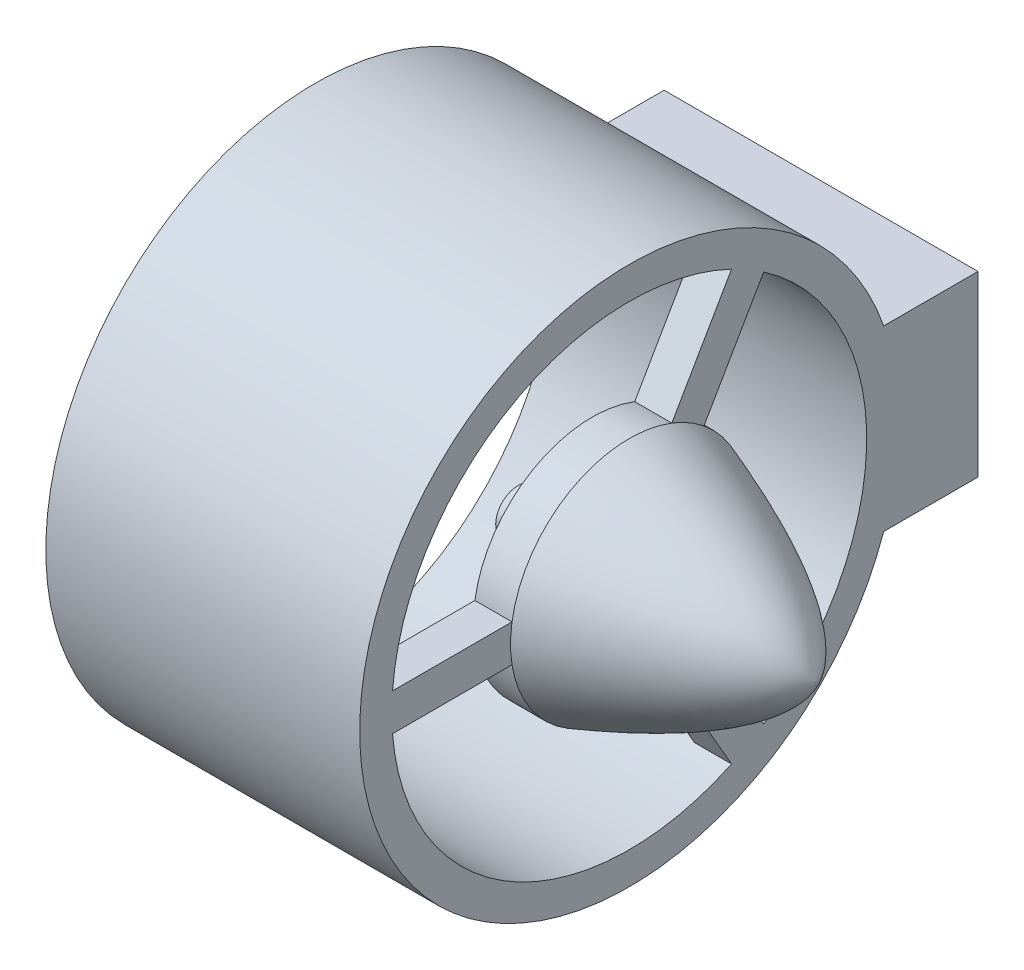
ISO-10303-21;
HEADER;
FILE_DESCRIPTION(('STEP AP214'),'2;1');
FILE_NAME('part.step','',(''),(''),'','','');
FILE_SCHEMA(('AUTOMOTIVE_DESIGN { 1 0 10303 214 1 1 1 1 }'));
ENDSEC;
DATA;
#1=APPLICATION_CONTEXT('core data for automotive mechanical design processes');
#2=APPLICATION_PROTOCOL_DEFINITION('international standard','automotive_design',2000,#1);
#3=PRODUCT_CONTEXT('',#1,'mechanical');
#4=PRODUCT('Part','Part','',(#3));
#5=PRODUCT_RELATED_PRODUCT_CATEGORY('part','',(#4));
#6=PRODUCT_DEFINITION_FORMATION('','',#4);
#7=PRODUCT_DEFINITION_CONTEXT('part definition',#1,'design');
#8=PRODUCT_DEFINITION('design','',#6,#7);
#9=PRODUCT_DEFINITION_SHAPE('','',#8);
#10=(LENGTH_UNIT() NAMED_UNIT(*) SI_UNIT(.MILLI.,.METRE.));
#11=(NAMED_UNIT(*) PLANE_ANGLE_UNIT() SI_UNIT($,.RADIAN.));
#12=(NAMED_UNIT(*) SI_UNIT($,.STERADIAN.) SOLID_ANGLE_UNIT());
#13=UNCERTAINTY_MEASURE_WITH_UNIT(LENGTH_MEASURE(1.E-05),#10,'distance_accuracy_value','');
#14=(GEOMETRIC_REPRESENTATION_CONTEXT(3) GLOBAL_UNCERTAINTY_ASSIGNED_CONTEXT((#13)) GLOBAL_UNIT_ASSIGNED_CONTEXT((#10,
#11,#12)) REPRESENTATION_CONTEXT('',''));
#15=CARTESIAN_POINT('',(0.,0.,0.));
#16=DIRECTION('',(0.,0.,1.));
#17=DIRECTION('',(1.,0.,0.));
#18=AXIS2_PLACEMENT_3D('',#15,#16,#17);
#19=CARTESIAN_POINT('',(-5.,0.,-47.));
#20=DIRECTION('',(0.,0.,1.));
#21=DIRECTION('',(1.,0.,0.));
#22=AXIS2_PLACEMENT_3D('',#19,#20,#21);
#23=PLANE('',#22);
#24=CARTESIAN_POINT('',(-3.65,-8.,-47.));
#25=DIRECTION('',(0.,0.,-1.));
#26=DIRECTION('',(-1.,0.,0.));
#27=AXIS2_PLACEMENT_3D('',#24,#25,#26);
#28=CIRCLE('',#27,1.24999999999999);
#29=CARTESIAN_POINT('',(-4.89999999999999,-8.,-47.));
#30=VERTEX_POINT('',#29);
#31=EDGE_CURVE('E194',#30,#30,#28,.T.);
#32=ORIENTED_EDGE('',*,*,#31,.F.);
#33=EDGE_LOOP('',(#32));
#34=FACE_BOUND('',#33,.T.);
#35=CARTESIAN_POINT('',(-3.65,8.,-47.));
#36=DIRECTION('',(0.,0.,-1.));
#37=DIRECTION('',(-1.,0.,0.));
#38=AXIS2_PLACEMENT_3D('',#35,#36,#37);
#39=CIRCLE('',#38,1.24999999999999);
#40=CARTESIAN_POINT('',(-4.89999999999999,8.,-47.));
#41=VERTEX_POINT('',#40);
#42=EDGE_CURVE('E193',#41,#41,#39,.T.);
#43=ORIENTED_EDGE('',*,*,#42,.F.);
#44=EDGE_LOOP('',(#43));
#45=FACE_BOUND('',#44,.T.);
#46=CARTESIAN_POINT('',(-38.65,8.,-47.));
#47=DIRECTION('',(0.,0.,-1.));
#48=DIRECTION('',(-1.,0.,0.));
#49=AXIS2_PLACEMENT_3D('',#46,#47,#48);
#50=CIRCLE('',#49,1.24999999999999);
#51=CARTESIAN_POINT('',(-39.9,8.,-47.));
#52=VERTEX_POINT('',#51);
#53=EDGE_CURVE('E204',#52,#52,#50,.T.);
#54=ORIENTED_EDGE('',*,*,#53,.F.);
#55=EDGE_LOOP('',(#54));
#56=FACE_BOUND('',#55,.T.);
#57=CARTESIAN_POINT('',(-42.6667808219178,0.,-47.));
#58=DIRECTION('',(0.,0.,-1.));
#59=DIRECTION('',(-1.,0.,0.));
#60=AXIS2_PLACEMENT_3D('',#57,#58,#59);
#61=CIRCLE('',#60,4.01678082191781);
#62=CARTESIAN_POINT('',(-42.3,-4.,-47.));
#63=VERTEX_POINT('',#62);
#64=CARTESIAN_POINT('',(-42.3,4.,-47.));
#65=VERTEX_POINT('',#64);
#66=EDGE_CURVE('E238',#63,#65,#61,.F.);
#67=ORIENTED_EDGE('',*,*,#66,.T.);
#68=DIRECTION('',(0.,-1.,0.));
#69=VECTOR('',#68,1.);
#70=CARTESIAN_POINT('',(-42.3,12.,-47.));
#71=LINE('',#70,#69);
#72=CARTESIAN_POINT('',(-42.3,12.,-47.));
#73=VERTEX_POINT('',#72);
#74=EDGE_CURVE('E261',#73,#65,#71,.T.);
#75=ORIENTED_EDGE('',*,*,#74,.F.);
#76=DIRECTION('',(1.,0.,0.));
#77=VECTOR('',#76,1.);
#78=CARTESIAN_POINT('',(-5.,12.,-47.));
#79=LINE('',#78,#77);
#80=CARTESIAN_POINT('',(0.,12.,-47.));
#81=VERTEX_POINT('',#80);
#82=EDGE_CURVE('E324',#73,#81,#79,.T.);
#83=ORIENTED_EDGE('',*,*,#82,.T.);
#84=DIRECTION('',(0.,-1.,0.));
#85=VECTOR('',#84,1.);
#86=CARTESIAN_POINT('',(0.,0.,-47.));
#87=LINE('',#86,#85);
#88=CARTESIAN_POINT('',(0.,-12.,-47.));
#89=VERTEX_POINT('',#88);
#90=EDGE_CURVE('E272',#81,#89,#87,.T.);
#91=ORIENTED_EDGE('',*,*,#90,.T.);
#92=DIRECTION('',(1.,0.,0.));
#93=VECTOR('',#92,1.);
#94=CARTESIAN_POINT('',(-5.,-12.,-47.));
#95=LINE('',#94,#93);
#96=CARTESIAN_POINT('',(-42.3,-12.,-47.));
#97=VERTEX_POINT('',#96);
#98=EDGE_CURVE('E327',#97,#89,#95,.T.);
#99=ORIENTED_EDGE('',*,*,#98,.F.);
#100=EDGE_CURVE('E260',#63,#97,#71,.T.);
#101=ORIENTED_EDGE('',*,*,#100,.F.);
#102=EDGE_LOOP('',(#67,#75,#83,#91,#99,#101));
#103=FACE_BOUND('',#102,.T.);
#104=CARTESIAN_POINT('',(-38.65,-8.,-47.));
#105=DIRECTION('',(0.,0.,-1.));
#106=DIRECTION('',(-1.,0.,0.));
#107=AXIS2_PLACEMENT_3D('',#104,#105,#106);
#108=CIRCLE('',#107,1.24999999999999);
#109=CARTESIAN_POINT('',(-39.9,-8.,-47.));
#110=VERTEX_POINT('',#109);
#111=EDGE_CURVE('E210',#110,#110,#108,.T.);
#112=ORIENTED_EDGE('',*,*,#111,.F.);
#113=EDGE_LOOP('',(#112));
#114=FACE_BOUND('',#113,.T.);
#115=ADVANCED_FACE('F40',(#34,#45,#56,#103,#114),#23,.F.);
#116=CARTESIAN_POINT('',(-42.3,0.,0.));
#117=DIRECTION('',(-1.,0.,0.));
#118=DIRECTION('',(0.,0.,1.));
#119=AXIS2_PLACEMENT_3D('',#116,#117,#118);
#120=PLANE('',#119);
#121=CARTESIAN_POINT('',(-42.3,29.4448637286709,-17.));
#122=DIRECTION('',(-1.,0.,0.));
#123=DIRECTION('',(0.,0.,1.));
#124=AXIS2_PLACEMENT_3D('',#121,#122,#123);
#125=CIRCLE('',#124,1.);
#126=CARTESIAN_POINT('',(-42.3,29.4448637286709,-16.));
#127=VERTEX_POINT('',#126);
#128=EDGE_CURVE('E221',#127,#127,#125,.T.);
#129=ORIENTED_EDGE('',*,*,#128,.F.);
#130=EDGE_LOOP('',(#129));
#131=FACE_BOUND('',#130,.T.);
#132=CARTESIAN_POINT('',(-42.3,-29.4448637286708,-17.0000000000001));
#133=DIRECTION('',(-1.,0.,0.));
#134=DIRECTION('',(0.,0.,1.));
#135=AXIS2_PLACEMENT_3D('',#132,#133,#134);
#136=CIRCLE('',#135,1.);
#137=CARTESIAN_POINT('',(-42.3,-29.4448637286708,-16.0000000000001));
#138=VERTEX_POINT('',#137);
#139=EDGE_CURVE('E216',#138,#138,#136,.T.);
#140=ORIENTED_EDGE('',*,*,#139,.F.);
#141=EDGE_LOOP('',(#140));
#142=FACE_BOUND('',#141,.T.);
#143=CARTESIAN_POINT('',(-42.3,0.,34.));
#144=DIRECTION('',(-1.,0.,0.));
#145=DIRECTION('',(0.,0.,1.));
#146=AXIS2_PLACEMENT_3D('',#143,#144,#145);
#147=CIRCLE('',#146,0.999999999999998);
#148=CARTESIAN_POINT('',(-42.3,0.,35.));
#149=VERTEX_POINT('',#148);
#150=EDGE_CURVE('E220',#149,#149,#147,.T.);
#151=ORIENTED_EDGE('',*,*,#150,.F.);
#152=EDGE_LOOP('',(#151));
#153=FACE_BOUND('',#152,.T.);
#154=CARTESIAN_POINT('',(-42.3,0.,0.));
#155=DIRECTION('',(-1.,0.,0.));
#156=DIRECTION('',(0.,0.,1.));
#157=AXIS2_PLACEMENT_3D('',#154,#155,#156);
#158=CIRCLE('',#157,32.);
#159=CARTESIAN_POINT('',(-42.3,0.,32.));
#160=VERTEX_POINT('',#159);
#161=EDGE_CURVE('E249',#160,#160,#158,.T.);
#162=ORIENTED_EDGE('',*,*,#161,.F.);
#163=EDGE_LOOP('',(#162));
#164=FACE_BOUND('',#163,.T.);
#165=ORIENTED_EDGE('',*,*,#74,.T.);
#166=DIRECTION('',(0.,0.,-1.));
#167=VECTOR('',#166,1.);
#168=CARTESIAN_POINT('',(-42.3,4.,-42.));
#169=LINE('',#168,#167);
#170=CARTESIAN_POINT('',(-42.3,4.,-42.));
#171=VERTEX_POINT('',#170);
#172=EDGE_CURVE('E247',#171,#65,#169,.T.);
#173=ORIENTED_EDGE('',*,*,#172,.F.);
#174=DIRECTION('',(0.,1.,0.));
#175=VECTOR('',#174,1.);
#176=CARTESIAN_POINT('',(-42.3,0.,-42.));
#177=LINE('',#176,#175);
#178=CARTESIAN_POINT('',(-42.3,-4.,-42.));
#179=VERTEX_POINT('',#178);
#180=EDGE_CURVE('E242',#179,#171,#177,.T.);
#181=ORIENTED_EDGE('',*,*,#180,.F.);
#182=DIRECTION('',(0.,0.,-1.));
#183=VECTOR('',#182,1.);
#184=CARTESIAN_POINT('',(-42.3,-4.,-42.));
#185=LINE('',#184,#183);
#186=EDGE_CURVE('E244',#179,#63,#185,.T.);
#187=ORIENTED_EDGE('',*,*,#186,.T.);
#188=ORIENTED_EDGE('',*,*,#100,.T.);
#189=DIRECTION('',(0.,0.,1.));
#190=VECTOR('',#189,1.);
#191=CARTESIAN_POINT('',(-42.3,-12.,-47.));
#192=LINE('',#191,#190);
#193=CARTESIAN_POINT('',(-42.3,-12.,-34.2909448688717));
#194=VERTEX_POINT('',#193);
#195=EDGE_CURVE('E264',#97,#194,#192,.T.);
#196=ORIENTED_EDGE('',*,*,#195,.T.);
#197=CARTESIAN_POINT('',(-42.3,0.,0.));
#198=DIRECTION('',(-1.,0.,0.));
#199=DIRECTION('',(0.,0.,1.));
#200=AXIS2_PLACEMENT_3D('',#197,#198,#199);
#201=CIRCLE('',#200,36.33);
#202=CARTESIAN_POINT('',(-42.3,12.,-34.2909448688717));
#203=VERTEX_POINT('',#202);
#204=EDGE_CURVE('E253',#194,#203,#201,.T.);
#205=ORIENTED_EDGE('',*,*,#204,.T.);
#206=DIRECTION('',(0.,0.,-1.));
#207=VECTOR('',#206,1.);
#208=CARTESIAN_POINT('',(-42.3,12.,-34.2909448688717));
#209=LINE('',#208,#207);
#210=EDGE_CURVE('E257',#203,#73,#209,.T.);
#211=ORIENTED_EDGE('',*,*,#210,.T.);
#212=EDGE_LOOP('',(#165,#173,#181,#187,#188,#196,#205,#211));
#213=FACE_BOUND('',#212,.T.);
#214=ADVANCED_FACE('F425',(#131,#142,#153,#164,#213),#120,.T.);
#215=CARTESIAN_POINT('',(-5.,0.,0.));
#216=DIRECTION('',(-1.,0.,0.));
#217=DIRECTION('',(0.,0.,1.));
#218=AXIS2_PLACEMENT_3D('',#215,#216,#217);
#219=PLANE('',#218);
#220=CARTESIAN_POINT('',(-5.,0.,0.));
#221=DIRECTION('',(-1.,0.,0.));
#222=DIRECTION('',(0.,0.,1.));
#223=AXIS2_PLACEMENT_3D('',#220,#221,#222);
#224=CIRCLE('',#223,3.);
#225=CARTESIAN_POINT('',(-5.,0.,3.));
#226=VERTEX_POINT('',#225);
#227=EDGE_CURVE('E232',#226,#226,#224,.T.);
#228=ORIENTED_EDGE('',*,*,#227,.F.);
#229=EDGE_LOOP('',(#228));
#230=FACE_BOUND('',#229,.T.);
#231=DIRECTION('',(0.,0.86602540378444,-0.499999999999998));
#232=VECTOR('',#231,1.);
#233=CARTESIAN_POINT('',(-5.,1.24999999999999,2.1650635094611));
#234=LINE('',#233,#232);
#235=CARTESIAN_POINT('',(-5.,14.936215693171,-5.73667680517842));
#236=VERTEX_POINT('',#235);
#237=CARTESIAN_POINT('',(-5.,28.8781106845908,-13.7860336314881));
#238=VERTEX_POINT('',#237);
#239=EDGE_CURVE('E281',#236,#238,#234,.T.);
#240=ORIENTED_EDGE('',*,*,#239,.T.);
#241=CARTESIAN_POINT('',(-5.,0.,0.));
#242=DIRECTION('',(-1.,0.,0.));
#243=DIRECTION('',(0.,0.,1.));
#244=AXIS2_PLACEMENT_3D('',#241,#242,#243);
#245=CIRCLE('',#244,32.);
#246=CARTESIAN_POINT('',(-5.,26.3781106845908,-18.1161606504103));
#247=VERTEX_POINT('',#246);
#248=EDGE_CURVE('E11',#238,#247,#245,.T.);
#249=ORIENTED_EDGE('',*,*,#248,.T.);
#250=DIRECTION('',(0.,0.86602540378444,-0.499999999999998));
#251=VECTOR('',#250,1.);
#252=CARTESIAN_POINT('',(-5.,-1.24999999999999,-2.1650635094611));
#253=LINE('',#252,#251);
#254=CARTESIAN_POINT('',(-5.,12.436215693171,-10.0668038241006));
#255=VERTEX_POINT('',#254);
#256=EDGE_CURVE('E284',#255,#247,#253,.T.);
#257=ORIENTED_EDGE('',*,*,#256,.F.);
#258=CARTESIAN_POINT('',(-5.,0.,0.));
#259=DIRECTION('',(-1.,0.,0.));
#260=DIRECTION('',(0.,0.,1.));
#261=AXIS2_PLACEMENT_3D('',#258,#259,#260);
#262=CIRCLE('',#261,16.);
#263=CARTESIAN_POINT('',(-5.,-12.436215693171,-10.0668038241006));
#264=VERTEX_POINT('',#263);
#265=EDGE_CURVE('E366',#255,#264,#262,.T.);
#266=ORIENTED_EDGE('',*,*,#265,.T.);
#267=DIRECTION('',(0.,-0.86602540378444,-0.499999999999998));
#268=VECTOR('',#267,1.);
#269=CARTESIAN_POINT('',(-5.,1.25,-2.1650635094611));
#270=LINE('',#269,#268);
#271=CARTESIAN_POINT('',(-5.,-26.3781106845908,-18.1161606504103));
#272=VERTEX_POINT('',#271);
#273=EDGE_CURVE('E268',#264,#272,#270,.T.);
#274=ORIENTED_EDGE('',*,*,#273,.T.);
#275=CARTESIAN_POINT('',(-5.,-28.8781106845908,-13.7860336314881));
#276=VERTEX_POINT('',#275);
#277=EDGE_CURVE('E51',#272,#276,#245,.T.);
#278=ORIENTED_EDGE('',*,*,#277,.T.);
#279=DIRECTION('',(0.,-0.86602540378444,-0.499999999999998));
#280=VECTOR('',#279,1.);
#281=CARTESIAN_POINT('',(-5.,-1.25,2.1650635094611));
#282=LINE('',#281,#280);
#283=CARTESIAN_POINT('',(-5.,-14.936215693171,-5.73667680517843));
#284=VERTEX_POINT('',#283);
#285=EDGE_CURVE('E271',#284,#276,#282,.T.);
#286=ORIENTED_EDGE('',*,*,#285,.F.);
#287=CARTESIAN_POINT('',(-5.,-2.5,15.8034806292791));
#288=VERTEX_POINT('',#287);
#289=EDGE_CURVE('E367',#284,#288,#262,.T.);
#290=ORIENTED_EDGE('',*,*,#289,.T.);
#291=DIRECTION('',(0.,0.,1.));
#292=VECTOR('',#291,1.);
#293=CARTESIAN_POINT('',(-5.,-2.5,0.));
#294=LINE('',#293,#292);
#295=CARTESIAN_POINT('',(-5.,-2.5,31.9021942818985));
#296=VERTEX_POINT('',#295);
#297=EDGE_CURVE('E275',#288,#296,#294,.T.);
#298=ORIENTED_EDGE('',*,*,#297,.T.);
#299=CARTESIAN_POINT('',(-5.,2.5,31.9021942818985));
#300=VERTEX_POINT('',#299);
#301=EDGE_CURVE('E53',#296,#300,#245,.T.);
#302=ORIENTED_EDGE('',*,*,#301,.T.);
#303=DIRECTION('',(0.,0.,1.));
#304=VECTOR('',#303,1.);
#305=CARTESIAN_POINT('',(-5.,2.5,0.));
#306=LINE('',#305,#304);
#307=CARTESIAN_POINT('',(-5.,2.5,15.8034806292791));
#308=VERTEX_POINT('',#307);
#309=EDGE_CURVE('E278',#308,#300,#306,.T.);
#310=ORIENTED_EDGE('',*,*,#309,.F.);
#311=EDGE_CURVE('E364',#308,#236,#262,.T.);
#312=ORIENTED_EDGE('',*,*,#311,.T.);
#313=EDGE_LOOP('',(#240,#249,#257,#266,#274,#278,#286,#290,#298,#302,#310,#312));
#314=FACE_BOUND('',#313,.T.);
#315=ADVANCED_FACE('F405',(#230,#314),#219,.T.);
#316=CARTESIAN_POINT('',(-5.,0.,0.));
#317=DIRECTION('',(1.,0.,0.));
#318=DIRECTION('',(0.,0.,-1.));
#319=AXIS2_PLACEMENT_3D('',#316,#317,#318);
#320=CYLINDRICAL_SURFACE('',#319,16.);
#321=DIRECTION('',(1.,0.,0.));
#322=VECTOR('',#321,1.);
#323=CARTESIAN_POINT('',(-5.,14.936215693171,-5.73667680517842));
#324=LINE('',#323,#322);
#325=CARTESIAN_POINT('',(0.,14.936215693171,-5.73667680517842));
#326=VERTEX_POINT('',#325);
#327=EDGE_CURVE('E339',#236,#326,#324,.T.);
#328=ORIENTED_EDGE('',*,*,#327,.F.);
#329=ORIENTED_EDGE('',*,*,#311,.F.);
#330=DIRECTION('',(1.,0.,0.));
#331=VECTOR('',#330,1.);
#332=CARTESIAN_POINT('',(-5.,2.5,15.8034806292791));
#333=LINE('',#332,#331);
#334=CARTESIAN_POINT('',(0.,2.5,15.8034806292791));
#335=VERTEX_POINT('',#334);
#336=EDGE_CURVE('E347',#308,#335,#333,.T.);
#337=ORIENTED_EDGE('',*,*,#336,.T.);
#338=CARTESIAN_POINT('',(0.,0.,0.));
#339=DIRECTION('',(-1.,0.,0.));
#340=DIRECTION('',(0.,0.,1.));
#341=AXIS2_PLACEMENT_3D('',#338,#339,#340);
#342=CIRCLE('',#341,16.);
#343=EDGE_CURVE('E368',#335,#326,#342,.T.);
#344=ORIENTED_EDGE('',*,*,#343,.T.);
#345=EDGE_LOOP('',(#328,#329,#337,#344));
#346=FACE_BOUND('',#345,.T.);
#347=ADVANCED_FACE('F518',(#346),#320,.T.);
#348=DIRECTION('',(1.,0.,0.));
#349=VECTOR('',#348,1.);
#350=CARTESIAN_POINT('',(-5.,-2.5,15.8034806292791));
#351=LINE('',#350,#349);
#352=CARTESIAN_POINT('',(0.,-2.5,15.8034806292791));
#353=VERTEX_POINT('',#352);
#354=EDGE_CURVE('E67',#288,#353,#351,.T.);
#355=ORIENTED_EDGE('',*,*,#354,.F.);
#356=ORIENTED_EDGE('',*,*,#289,.F.);
#357=DIRECTION('',(1.,0.,0.));
#358=VECTOR('',#357,1.);
#359=CARTESIAN_POINT('',(-5.,-14.936215693171,-5.73667680517843));
#360=LINE('',#359,#358);
#361=CARTESIAN_POINT('',(0.,-14.936215693171,-5.73667680517843));
#362=VERTEX_POINT('',#361);
#363=EDGE_CURVE('E356',#284,#362,#360,.T.);
#364=ORIENTED_EDGE('',*,*,#363,.T.);
#365=EDGE_CURVE('E326',#362,#353,#342,.T.);
#366=ORIENTED_EDGE('',*,*,#365,.T.);
#367=EDGE_LOOP('',(#355,#356,#364,#366));
#368=FACE_BOUND('',#367,.T.);
#369=ADVANCED_FACE('F373',(#368),#320,.T.);
#370=ORIENTED_EDGE('',*,*,#265,.F.);
#371=DIRECTION('',(1.,0.,0.));
#372=VECTOR('',#371,1.);
#373=CARTESIAN_POINT('',(-5.,12.436215693171,-10.0668038241006));
#374=LINE('',#373,#372);
#375=CARTESIAN_POINT('',(0.,12.436215693171,-10.0668038241006));
#376=VERTEX_POINT('',#375);
#377=EDGE_CURVE('E336',#255,#376,#374,.T.);
#378=ORIENTED_EDGE('',*,*,#377,.T.);
#379=CARTESIAN_POINT('',(0.,-12.436215693171,-10.0668038241006));
#380=VERTEX_POINT('',#379);
#381=EDGE_CURVE('E370',#376,#380,#342,.T.);
#382=ORIENTED_EDGE('',*,*,#381,.T.);
#383=DIRECTION('',(1.,0.,0.));
#384=VECTOR('',#383,1.);
#385=CARTESIAN_POINT('',(-5.,-12.436215693171,-10.0668038241006));
#386=LINE('',#385,#384);
#387=EDGE_CURVE('E359',#264,#380,#386,.T.);
#388=ORIENTED_EDGE('',*,*,#387,.F.);
#389=EDGE_LOOP('',(#370,#378,#382,#388));
#390=FACE_BOUND('',#389,.T.);
#391=ADVANCED_FACE('F780',(#390),#320,.T.);
#392=CARTESIAN_POINT('',(0.,-16.,0.));
#393=CARTESIAN_POINT('',(22.5,-8.,0.));
#394=CARTESIAN_POINT('',(25.,0.,0.));
#395=B_SPLINE_CURVE_WITH_KNOTS('',2,(#392,#393,#394),.UNSPECIFIED.,.F.,.F.,(3,3),(0.,1.),.UNSPECIFIED.);
#396=CARTESIAN_POINT('',(25.,0.,0.));
#397=DIRECTION('',(1.,0.,0.));
#398=AXIS1_PLACEMENT('',#396,#397);
#399=SURFACE_OF_REVOLUTION('',#395,#398);
#400=CARTESIAN_POINT('',(25.,0.,0.));
#401=VERTEX_POINT('',#400);
#402=VERTEX_LOOP('',#401);
#403=FACE_BOUND('',#402,.T.);
#404=ORIENTED_EDGE('',*,*,#343,.F.);
#405=CARTESIAN_POINT('',(0.,0.,0.));
#406=DIRECTION('',(1.,0.,0.));
#407=DIRECTION('',(0.,0.,-1.));
#408=AXIS2_PLACEMENT_3D('',#405,#406,#407);
#409=CIRCLE('',#408,16.);
#410=EDGE_CURVE('E301',#335,#353,#409,.T.);
#411=ORIENTED_EDGE('',*,*,#410,.T.);
#412=ORIENTED_EDGE('',*,*,#365,.F.);
#413=CARTESIAN_POINT('',(0.,0.,0.));
#414=DIRECTION('',(1.,0.,0.));
#415=DIRECTION('',(0.,0.,-1.));
#416=AXIS2_PLACEMENT_3D('',#413,#414,#415);
#417=CIRCLE('',#416,16.);
#418=EDGE_CURVE('E294',#362,#380,#417,.T.);
#419=ORIENTED_EDGE('',*,*,#418,.T.);
#420=ORIENTED_EDGE('',*,*,#381,.F.);
#421=CARTESIAN_POINT('',(0.,0.,0.));
#422=DIRECTION('',(1.,0.,0.));
#423=DIRECTION('',(0.,0.,-1.));
#424=AXIS2_PLACEMENT_3D('',#421,#422,#423);
#425=CIRCLE('',#424,16.);
#426=EDGE_CURVE('E308',#376,#326,#425,.T.);
#427=ORIENTED_EDGE('',*,*,#426,.T.);
#428=EDGE_LOOP('',(#404,#411,#412,#419,#420,#427));
#429=FACE_BOUND('',#428,.T.);
#430=ADVANCED_FACE('F42',(#403,#429),#399,.T.);
#431=CARTESIAN_POINT('',(-5.,12.,0.));
#432=DIRECTION('',(0.,1.,0.));
#433=DIRECTION('',(0.,0.,1.));
#434=AXIS2_PLACEMENT_3D('',#431,#432,#433);
#435=PLANE('',#434);
#436=DIRECTION('',(0.,0.,1.));
#437=VECTOR('',#436,1.);
#438=CARTESIAN_POINT('',(0.,12.,0.));
#439=LINE('',#438,#437);
#440=CARTESIAN_POINT('',(0.,12.,-34.2909448688717));
#441=VERTEX_POINT('',#440);
#442=EDGE_CURVE('E313',#81,#441,#439,.T.);
#443=ORIENTED_EDGE('',*,*,#442,.F.);
#444=ORIENTED_EDGE('',*,*,#82,.F.);
#445=ORIENTED_EDGE('',*,*,#210,.F.);
#446=DIRECTION('',(1.,0.,0.));
#447=VECTOR('',#446,1.);
#448=CARTESIAN_POINT('',(-5.,12.,-34.2909448688717));
#449=LINE('',#448,#447);
#450=EDGE_CURVE('E332',#203,#441,#449,.T.);
#451=ORIENTED_EDGE('',*,*,#450,.T.);
#452=EDGE_LOOP('',(#443,#444,#445,#451));
#453=FACE_BOUND('',#452,.T.);
#454=ADVANCED_FACE('F440',(#453),#435,.T.);
#455=CARTESIAN_POINT('',(-5.,-12.,0.));
#456=DIRECTION('',(0.,1.,0.));
#457=DIRECTION('',(0.,0.,1.));
#458=AXIS2_PLACEMENT_3D('',#455,#456,#457);
#459=PLANE('',#458);
#460=DIRECTION('',(0.,0.,1.));
#461=VECTOR('',#460,1.);
#462=CARTESIAN_POINT('',(0.,-12.,0.));
#463=LINE('',#462,#461);
#464=CARTESIAN_POINT('',(0.,-12.,-34.2909448688717));
#465=VERTEX_POINT('',#464);
#466=EDGE_CURVE('E319',#89,#465,#463,.T.);
#467=ORIENTED_EDGE('',*,*,#466,.T.);
#468=DIRECTION('',(1.,0.,0.));
#469=VECTOR('',#468,1.);
#470=CARTESIAN_POINT('',(-5.,-12.,-34.2909448688717));
#471=LINE('',#470,#469);
#472=EDGE_CURVE('E330',#194,#465,#471,.T.);
#473=ORIENTED_EDGE('',*,*,#472,.F.);
#474=ORIENTED_EDGE('',*,*,#195,.F.);
#475=ORIENTED_EDGE('',*,*,#98,.T.);
#476=EDGE_LOOP('',(#467,#473,#474,#475));
#477=FACE_BOUND('',#476,.T.);
#478=ADVANCED_FACE('F437',(#477),#459,.F.);
#479=CARTESIAN_POINT('',(-5.,0.,0.));
#480=DIRECTION('',(1.,0.,0.));
#481=DIRECTION('',(0.,0.,-1.));
#482=AXIS2_PLACEMENT_3D('',#479,#480,#481);
#483=CYLINDRICAL_SURFACE('',#482,32.);
#484=CARTESIAN_POINT('',(0.,0.,0.));
#485=DIRECTION('',(1.,0.,0.));
#486=DIRECTION('',(0.,0.,-1.));
#487=AXIS2_PLACEMENT_3D('',#484,#485,#486);
#488=CIRCLE('',#487,32.);
#489=CARTESIAN_POINT('',(0.,-26.3781106845908,-18.1161606504103));
#490=VERTEX_POINT('',#489);
#491=CARTESIAN_POINT('',(0.,26.3781106845908,-18.1161606504103));
#492=VERTEX_POINT('',#491);
#493=EDGE_CURVE('E267',#490,#492,#488,.T.);
#494=ORIENTED_EDGE('',*,*,#493,.T.);
#495=DIRECTION('',(1.,0.,0.));
#496=VECTOR('',#495,1.);
#497=CARTESIAN_POINT('',(-5.,26.3781106845908,-18.1161606504103));
#498=LINE('',#497,#496);
#499=EDGE_CURVE('E334',#247,#492,#498,.T.);
#500=ORIENTED_EDGE('',*,*,#499,.F.);
#501=ORIENTED_EDGE('',*,*,#248,.F.);
#502=DIRECTION('',(1.,0.,0.));
#503=VECTOR('',#502,1.);
#504=CARTESIAN_POINT('',(-5.,28.8781106845908,-13.7860336314881));
#505=LINE('',#504,#503);
#506=CARTESIAN_POINT('',(0.,28.8781106845908,-13.7860336314881));
#507=VERTEX_POINT('',#506);
#508=EDGE_CURVE('E342',#238,#507,#505,.T.);
#509=ORIENTED_EDGE('',*,*,#508,.T.);
#510=CARTESIAN_POINT('',(0.,2.5,31.9021942818985));
#511=VERTEX_POINT('',#510);
#512=EDGE_CURVE('E291',#507,#511,#488,.T.);
#513=ORIENTED_EDGE('',*,*,#512,.T.);
#514=DIRECTION('',(1.,0.,0.));
#515=VECTOR('',#514,1.);
#516=CARTESIAN_POINT('',(-5.,2.5,31.9021942818985));
#517=LINE('',#516,#515);
#518=EDGE_CURVE('E345',#300,#511,#517,.T.);
#519=ORIENTED_EDGE('',*,*,#518,.F.);
#520=ORIENTED_EDGE('',*,*,#301,.F.);
#521=DIRECTION('',(1.,0.,0.));
#522=VECTOR('',#521,1.);
#523=CARTESIAN_POINT('',(-5.,-2.5,31.9021942818985));
#524=LINE('',#523,#522);
#525=CARTESIAN_POINT('',(0.,-2.5,31.9021942818985));
#526=VERTEX_POINT('',#525);
#527=EDGE_CURVE('E351',#296,#526,#524,.T.);
#528=ORIENTED_EDGE('',*,*,#527,.T.);
#529=CARTESIAN_POINT('',(0.,-28.8781106845908,-13.7860336314881));
#530=VERTEX_POINT('',#529);
#531=EDGE_CURVE('E292',#526,#530,#488,.T.);
#532=ORIENTED_EDGE('',*,*,#531,.T.);
#533=DIRECTION('',(1.,0.,0.));
#534=VECTOR('',#533,1.);
#535=CARTESIAN_POINT('',(-5.,-28.8781106845908,-13.7860336314881));
#536=LINE('',#535,#534);
#537=EDGE_CURVE('E354',#276,#530,#536,.T.);
#538=ORIENTED_EDGE('',*,*,#537,.F.);
#539=ORIENTED_EDGE('',*,*,#277,.F.);
#540=DIRECTION('',(1.,0.,0.));
#541=VECTOR('',#540,1.);
#542=CARTESIAN_POINT('',(-5.,-26.3781106845908,-18.1161606504103));
#543=LINE('',#542,#541);
#544=EDGE_CURVE('E287',#272,#490,#543,.T.);
#545=ORIENTED_EDGE('',*,*,#544,.T.);
#546=EDGE_LOOP('',(#494,#500,#501,#509,#513,#519,#520,#528,#532,#538,#539,#545));
#547=FACE_BOUND('',#546,.T.);
#548=ORIENTED_EDGE('',*,*,#161,.T.);
#549=EDGE_LOOP('',(#548));
#550=FACE_BOUND('',#549,.T.);
#551=ADVANCED_FACE('F396',(#547,#550),#483,.F.);
#552=CARTESIAN_POINT('',(-5.,-1.24999999999999,-2.1650635094611));
#553=DIRECTION('',(0.,-0.499999999999998,-0.86602540378444));
#554=DIRECTION('',(0.,0.86602540378444,-0.499999999999998));
#555=AXIS2_PLACEMENT_3D('',#552,#553,#554);
#556=PLANE('',#555);
#557=DIRECTION('',(0.,0.86602540378444,-0.499999999999998));
#558=VECTOR('',#557,1.);
#559=CARTESIAN_POINT('',(0.,-1.24999999999999,-2.1650635094611));
#560=LINE('',#559,#558);
#561=EDGE_CURVE('E310',#376,#492,#560,.T.);
#562=ORIENTED_EDGE('',*,*,#561,.F.);
#563=ORIENTED_EDGE('',*,*,#377,.F.);
#564=ORIENTED_EDGE('',*,*,#256,.T.);
#565=ORIENTED_EDGE('',*,*,#499,.T.);
#566=EDGE_LOOP('',(#562,#563,#564,#565));
#567=FACE_BOUND('',#566,.T.);
#568=ADVANCED_FACE('F448',(#567),#556,.T.);
#569=CARTESIAN_POINT('',(-5.,1.24999999999999,2.1650635094611));
#570=DIRECTION('',(0.,-0.499999999999998,-0.86602540378444));
#571=DIRECTION('',(0.,0.86602540378444,-0.499999999999998));
#572=AXIS2_PLACEMENT_3D('',#569,#570,#571);
#573=PLANE('',#572);
#574=DIRECTION('',(0.,0.86602540378444,-0.499999999999998));
#575=VECTOR('',#574,1.);
#576=CARTESIAN_POINT('',(0.,1.24999999999999,2.1650635094611));
#577=LINE('',#576,#575);
#578=EDGE_CURVE('E306',#326,#507,#577,.T.);
#579=ORIENTED_EDGE('',*,*,#578,.T.);
#580=ORIENTED_EDGE('',*,*,#508,.F.);
#581=ORIENTED_EDGE('',*,*,#239,.F.);
#582=ORIENTED_EDGE('',*,*,#327,.T.);
#583=EDGE_LOOP('',(#579,#580,#581,#582));
#584=FACE_BOUND('',#583,.T.);
#585=ADVANCED_FACE('F451',(#584),#573,.F.);
#586=CARTESIAN_POINT('',(-5.,2.5,0.));
#587=DIRECTION('',(0.,1.,0.));
#588=DIRECTION('',(0.,0.,1.));
#589=AXIS2_PLACEMENT_3D('',#586,#587,#588);
#590=PLANE('',#589);
#591=DIRECTION('',(0.,0.,1.));
#592=VECTOR('',#591,1.);
#593=CARTESIAN_POINT('',(0.,2.5,0.));
#594=LINE('',#593,#592);
#595=EDGE_CURVE('E303',#335,#511,#594,.T.);
#596=ORIENTED_EDGE('',*,*,#595,.F.);
#597=ORIENTED_EDGE('',*,*,#336,.F.);
#598=ORIENTED_EDGE('',*,*,#309,.T.);
#599=ORIENTED_EDGE('',*,*,#518,.T.);
#600=EDGE_LOOP('',(#596,#597,#598,#599));
#601=FACE_BOUND('',#600,.T.);
#602=ADVANCED_FACE('F402',(#601),#590,.T.);
#603=CARTESIAN_POINT('',(-5.,-2.5,0.));
#604=DIRECTION('',(0.,1.,0.));
#605=DIRECTION('',(0.,0.,1.));
#606=AXIS2_PLACEMENT_3D('',#603,#604,#605);
#607=PLANE('',#606);
#608=DIRECTION('',(0.,0.,1.));
#609=VECTOR('',#608,1.);
#610=CARTESIAN_POINT('',(0.,-2.5,0.));
#611=LINE('',#610,#609);
#612=EDGE_CURVE('E299',#353,#526,#611,.T.);
#613=ORIENTED_EDGE('',*,*,#612,.T.);
#614=ORIENTED_EDGE('',*,*,#527,.F.);
#615=ORIENTED_EDGE('',*,*,#297,.F.);
#616=ORIENTED_EDGE('',*,*,#354,.T.);
#617=EDGE_LOOP('',(#613,#614,#615,#616));
#618=FACE_BOUND('',#617,.T.);
#619=ADVANCED_FACE('F380',(#618),#607,.F.);
#620=CARTESIAN_POINT('',(-5.,-1.25,2.1650635094611));
#621=DIRECTION('',(0.,-0.499999999999998,0.86602540378444));
#622=DIRECTION('',(0.,-0.86602540378444,-0.499999999999998));
#623=AXIS2_PLACEMENT_3D('',#620,#621,#622);
#624=PLANE('',#623);
#625=DIRECTION('',(0.,-0.86602540378444,-0.499999999999998));
#626=VECTOR('',#625,1.);
#627=CARTESIAN_POINT('',(0.,-1.25,2.1650635094611));
#628=LINE('',#627,#626);
#629=EDGE_CURVE('E296',#362,#530,#628,.T.);
#630=ORIENTED_EDGE('',*,*,#629,.F.);
#631=ORIENTED_EDGE('',*,*,#363,.F.);
#632=ORIENTED_EDGE('',*,*,#285,.T.);
#633=ORIENTED_EDGE('',*,*,#537,.T.);
#634=EDGE_LOOP('',(#630,#631,#632,#633));
#635=FACE_BOUND('',#634,.T.);
#636=ADVANCED_FACE('F412',(#635),#624,.T.);
#637=CARTESIAN_POINT('',(-5.,1.25,-2.1650635094611));
#638=DIRECTION('',(0.,-0.499999999999998,0.86602540378444));
#639=DIRECTION('',(0.,-0.86602540378444,-0.499999999999998));
#640=AXIS2_PLACEMENT_3D('',#637,#638,#639);
#641=PLANE('',#640);
#642=DIRECTION('',(0.,-0.86602540378444,-0.499999999999998));
#643=VECTOR('',#642,1.);
#644=CARTESIAN_POINT('',(0.,1.25,-2.1650635094611));
#645=LINE('',#644,#643);
#646=EDGE_CURVE('E290',#380,#490,#645,.T.);
#647=ORIENTED_EDGE('',*,*,#646,.T.);
#648=ORIENTED_EDGE('',*,*,#544,.F.);
#649=ORIENTED_EDGE('',*,*,#273,.F.);
#650=ORIENTED_EDGE('',*,*,#387,.T.);
#651=EDGE_LOOP('',(#647,#648,#649,#650));
#652=FACE_BOUND('',#651,.T.);
#653=ADVANCED_FACE('F414',(#652),#641,.F.);
#654=CARTESIAN_POINT('',(-5.,0.,0.));
#655=DIRECTION('',(1.,0.,0.));
#656=DIRECTION('',(0.,0.,-1.));
#657=AXIS2_PLACEMENT_3D('',#654,#655,#656);
#658=CYLINDRICAL_SURFACE('',#657,36.33);
#659=CARTESIAN_POINT('',(0.,0.,0.));
#660=DIRECTION('',(1.,0.,0.));
#661=DIRECTION('',(0.,0.,-1.));
#662=AXIS2_PLACEMENT_3D('',#659,#660,#661);
#663=CIRCLE('',#662,36.33);
#664=EDGE_CURVE('E316',#441,#465,#663,.T.);
#665=ORIENTED_EDGE('',*,*,#664,.F.);
#666=ORIENTED_EDGE('',*,*,#450,.F.);
#667=ORIENTED_EDGE('',*,*,#204,.F.);
#668=ORIENTED_EDGE('',*,*,#472,.T.);
#669=EDGE_LOOP('',(#665,#666,#667,#668));
#670=FACE_BOUND('',#669,.T.);
#671=ADVANCED_FACE('F420',(#670),#658,.T.);
#672=CARTESIAN_POINT('',(0.,0.,0.));
#673=DIRECTION('',(1.,0.,0.));
#674=DIRECTION('',(0.,0.,-1.));
#675=AXIS2_PLACEMENT_3D('',#672,#673,#674);
#676=PLANE('',#675);
#677=ORIENTED_EDGE('',*,*,#493,.F.);
#678=ORIENTED_EDGE('',*,*,#646,.F.);
#679=ORIENTED_EDGE('',*,*,#418,.F.);
#680=ORIENTED_EDGE('',*,*,#629,.T.);
#681=ORIENTED_EDGE('',*,*,#531,.F.);
#682=ORIENTED_EDGE('',*,*,#612,.F.);
#683=ORIENTED_EDGE('',*,*,#410,.F.);
#684=ORIENTED_EDGE('',*,*,#595,.T.);
#685=ORIENTED_EDGE('',*,*,#512,.F.);
#686=ORIENTED_EDGE('',*,*,#578,.F.);
#687=ORIENTED_EDGE('',*,*,#426,.F.);
#688=ORIENTED_EDGE('',*,*,#561,.T.);
#689=EDGE_LOOP('',(#677,#678,#679,#680,#681,#682,#683,#684,#685,#686,#687,#688));
#690=FACE_BOUND('',#689,.T.);
#691=ORIENTED_EDGE('',*,*,#442,.T.);
#692=ORIENTED_EDGE('',*,*,#664,.T.);
#693=ORIENTED_EDGE('',*,*,#466,.F.);
#694=ORIENTED_EDGE('',*,*,#90,.F.);
#695=EDGE_LOOP('',(#691,#692,#693,#694));
#696=FACE_BOUND('',#695,.T.);
#697=ADVANCED_FACE('F386',(#690,#696),#676,.T.);
#698=CARTESIAN_POINT('',(-42.6667808219178,0.,-42.));
#699=DIRECTION('',(0.,0.,-1.));
#700=DIRECTION('',(-1.,0.,0.));
#701=AXIS2_PLACEMENT_3D('',#698,#699,#700);
#702=CYLINDRICAL_SURFACE('',#701,4.01678082191781);
#703=ORIENTED_EDGE('',*,*,#66,.F.);
#704=ORIENTED_EDGE('',*,*,#186,.F.);
#705=CARTESIAN_POINT('',(-42.6667808219178,0.,-42.));
#706=DIRECTION('',(0.,0.,-1.));
#707=DIRECTION('',(-1.,0.,0.));
#708=AXIS2_PLACEMENT_3D('',#705,#706,#707);
#709=CIRCLE('',#708,4.01678082191781);
#710=EDGE_CURVE('E59',#179,#171,#709,.F.);
#711=ORIENTED_EDGE('',*,*,#710,.T.);
#712=ORIENTED_EDGE('',*,*,#172,.T.);
#713=EDGE_LOOP('',(#703,#704,#711,#712));
#714=FACE_BOUND('',#713,.T.);
#715=ADVANCED_FACE('F492',(#714),#702,.F.);
#716=CARTESIAN_POINT('',(0.,0.,-42.));
#717=DIRECTION('',(0.,0.,-1.));
#718=DIRECTION('',(-1.,0.,0.));
#719=AXIS2_PLACEMENT_3D('',#716,#717,#718);
#720=PLANE('',#719);
#721=ORIENTED_EDGE('',*,*,#710,.F.);
#722=ORIENTED_EDGE('',*,*,#180,.T.);
#723=EDGE_LOOP('',(#721,#722));
#724=FACE_BOUND('',#723,.T.);
#725=ADVANCED_FACE('F497',(#724),#720,.T.);
#726=CARTESIAN_POINT('',(-15.,0.,0.));
#727=DIRECTION('',(1.,0.,0.));
#728=DIRECTION('',(0.,0.,-1.));
#729=AXIS2_PLACEMENT_3D('',#726,#727,#728);
#730=CYLINDRICAL_SURFACE('',#729,3.);
#731=CARTESIAN_POINT('',(-15.,0.,0.));
#732=DIRECTION('',(-1.,0.,0.));
#733=DIRECTION('',(0.,0.,1.));
#734=AXIS2_PLACEMENT_3D('',#731,#732,#733);
#735=CIRCLE('',#734,3.);
#736=CARTESIAN_POINT('',(-15.,0.,3.));
#737=VERTEX_POINT('',#736);
#738=EDGE_CURVE('E235',#737,#737,#735,.T.);
#739=ORIENTED_EDGE('',*,*,#738,.F.);
#740=EDGE_LOOP('',(#739));
#741=FACE_BOUND('',#740,.T.);
#742=ORIENTED_EDGE('',*,*,#227,.T.);
#743=EDGE_LOOP('',(#742));
#744=FACE_BOUND('',#743,.T.);
#745=ADVANCED_FACE('F507',(#741,#744),#730,.T.);
#746=CARTESIAN_POINT('',(-15.,0.,0.));
#747=DIRECTION('',(-1.,0.,0.));
#748=DIRECTION('',(0.,0.,1.));
#749=AXIS2_PLACEMENT_3D('',#746,#747,#748);
#750=PLANE('',#749);
#751=ORIENTED_EDGE('',*,*,#738,.T.);
#752=EDGE_LOOP('',(#751));
#753=FACE_BOUND('',#752,.T.);
#754=ADVANCED_FACE('F529',(#753),#750,.T.);
#755=CARTESIAN_POINT('',(-32.3,0.,34.));
#756=DIRECTION('',(-1.,0.,0.));
#757=DIRECTION('',(0.,0.,1.));
#758=AXIS2_PLACEMENT_3D('',#755,#756,#757);
#759=CYLINDRICAL_SURFACE('',#758,0.999999999999998);
#760=CARTESIAN_POINT('',(-32.3,0.,34.));
#761=DIRECTION('',(-1.,0.,0.));
#762=DIRECTION('',(0.,0.,1.));
#763=AXIS2_PLACEMENT_3D('',#760,#761,#762);
#764=CIRCLE('',#763,0.999999999999998);
#765=CARTESIAN_POINT('',(-32.3,0.,35.));
#766=VERTEX_POINT('',#765);
#767=EDGE_CURVE('E229',#766,#766,#764,.T.);
#768=ORIENTED_EDGE('',*,*,#767,.F.);
#769=EDGE_LOOP('',(#768));
#770=FACE_BOUND('',#769,.T.);
#771=ORIENTED_EDGE('',*,*,#150,.T.);
#772=EDGE_LOOP('',(#771));
#773=FACE_BOUND('',#772,.T.);
#774=ADVANCED_FACE('F539',(#770,#773),#759,.F.);
#775=CARTESIAN_POINT('',(-32.3,0.,34.));
#776=DIRECTION('',(-1.,0.,0.));
#777=DIRECTION('',(0.,0.,1.));
#778=AXIS2_PLACEMENT_3D('',#775,#776,#777);
#779=PLANE('',#778);
#780=ORIENTED_EDGE('',*,*,#767,.T.);
#781=EDGE_LOOP('',(#780));
#782=FACE_BOUND('',#781,.T.);
#783=ADVANCED_FACE('F554',(#782),#779,.T.);
#784=CARTESIAN_POINT('',(-32.3,-29.4448637286708,-17.0000000000001));
#785=DIRECTION('',(-1.,0.,0.));
#786=DIRECTION('',(0.,0.,1.));
#787=AXIS2_PLACEMENT_3D('',#784,#785,#786);
#788=CYLINDRICAL_SURFACE('',#787,1.);
#789=CARTESIAN_POINT('',(-32.3,-29.4448637286708,-17.0000000000001));
#790=DIRECTION('',(-1.,0.,0.));
#791=DIRECTION('',(0.,0.,1.));
#792=AXIS2_PLACEMENT_3D('',#789,#790,#791);
#793=CIRCLE('',#792,1.);
#794=CARTESIAN_POINT('',(-32.3,-29.4448637286708,-16.0000000000001));
#795=VERTEX_POINT('',#794);
#796=EDGE_CURVE('E224',#795,#795,#793,.T.);
#797=ORIENTED_EDGE('',*,*,#796,.F.);
#798=EDGE_LOOP('',(#797));
#799=FACE_BOUND('',#798,.T.);
#800=ORIENTED_EDGE('',*,*,#139,.T.);
#801=EDGE_LOOP('',(#800));
#802=FACE_BOUND('',#801,.T.);
#803=ADVANCED_FACE('F564',(#799,#802),#788,.F.);
#804=CARTESIAN_POINT('',(-32.3,-29.4448637286708,-17.0000000000001));
#805=DIRECTION('',(-1.,0.,0.));
#806=DIRECTION('',(0.,0.,1.));
#807=AXIS2_PLACEMENT_3D('',#804,#805,#806);
#808=PLANE('',#807);
#809=ORIENTED_EDGE('',*,*,#796,.T.);
#810=EDGE_LOOP('',(#809));
#811=FACE_BOUND('',#810,.T.);
#812=ADVANCED_FACE('F574',(#811),#808,.T.);
#813=CARTESIAN_POINT('',(-32.3,29.4448637286709,-17.));
#814=DIRECTION('',(-1.,0.,0.));
#815=DIRECTION('',(0.,0.,1.));
#816=AXIS2_PLACEMENT_3D('',#813,#814,#815);
#817=CYLINDRICAL_SURFACE('',#816,1.);
#818=CARTESIAN_POINT('',(-32.3,29.4448637286709,-17.));
#819=DIRECTION('',(-1.,0.,0.));
#820=DIRECTION('',(0.,0.,1.));
#821=AXIS2_PLACEMENT_3D('',#818,#819,#820);
#822=CIRCLE('',#821,1.);
#823=CARTESIAN_POINT('',(-32.3,29.4448637286709,-16.));
#824=VERTEX_POINT('',#823);
#825=EDGE_CURVE('E217',#824,#824,#822,.T.);
#826=ORIENTED_EDGE('',*,*,#825,.F.);
#827=EDGE_LOOP('',(#826));
#828=FACE_BOUND('',#827,.T.);
#829=ORIENTED_EDGE('',*,*,#128,.T.);
#830=EDGE_LOOP('',(#829));
#831=FACE_BOUND('',#830,.T.);
#832=ADVANCED_FACE('F584',(#828,#831),#817,.F.);
#833=CARTESIAN_POINT('',(-32.3,29.4448637286709,-17.));
#834=DIRECTION('',(-1.,0.,0.));
#835=DIRECTION('',(0.,0.,1.));
#836=AXIS2_PLACEMENT_3D('',#833,#834,#835);
#837=PLANE('',#836);
#838=ORIENTED_EDGE('',*,*,#825,.T.);
#839=EDGE_LOOP('',(#838));
#840=FACE_BOUND('',#839,.T.);
#841=ADVANCED_FACE('F594',(#840),#837,.T.);
#842=CARTESIAN_POINT('',(-38.65,-8.,-32.1));
#843=DIRECTION('',(0.,0.,-1.));
#844=DIRECTION('',(-1.,0.,0.));
#845=AXIS2_PLACEMENT_3D('',#842,#843,#844);
#846=CONICAL_SURFACE('',#845,1.24999999999999,1.02974425867665);
#847=CARTESIAN_POINT('',(-38.65,-8.,-31.3489242262155));
#848=VERTEX_POINT('',#847);
#849=VERTEX_LOOP('',#848);
#850=FACE_BOUND('',#849,.T.);
#851=CARTESIAN_POINT('',(-38.65,-8.,-32.1));
#852=DIRECTION('',(0.,0.,-1.));
#853=DIRECTION('',(-1.,0.,0.));
#854=AXIS2_PLACEMENT_3D('',#851,#852,#853);
#855=CIRCLE('',#854,1.24999999999999);
#856=CARTESIAN_POINT('',(-39.9,-8.,-32.1));
#857=VERTEX_POINT('',#856);
#858=EDGE_CURVE('E213',#857,#857,#855,.T.);
#859=ORIENTED_EDGE('',*,*,#858,.T.);
#860=EDGE_LOOP('',(#859));
#861=FACE_BOUND('',#860,.T.);
#862=ADVANCED_FACE('F603',(#850,#861),#846,.F.);
#863=CARTESIAN_POINT('',(-38.65,-8.,-47.));
#864=DIRECTION('',(0.,0.,-1.));
#865=DIRECTION('',(-1.,0.,0.));
#866=AXIS2_PLACEMENT_3D('',#863,#864,#865);
#867=CYLINDRICAL_SURFACE('',#866,1.24999999999999);
#868=ORIENTED_EDGE('',*,*,#858,.F.);
#869=EDGE_LOOP('',(#868));
#870=FACE_BOUND('',#869,.T.);
#871=ORIENTED_EDGE('',*,*,#111,.T.);
#872=EDGE_LOOP('',(#871));
#873=FACE_BOUND('',#872,.T.);
#874=ADVANCED_FACE('F619',(#870,#873),#867,.F.);
#875=CARTESIAN_POINT('',(-38.65,8.,-32.1));
#876=DIRECTION('',(0.,0.,-1.));
#877=DIRECTION('',(-1.,0.,0.));
#878=AXIS2_PLACEMENT_3D('',#875,#876,#877);
#879=CONICAL_SURFACE('',#878,1.24999999999999,1.02974425867665);
#880=CARTESIAN_POINT('',(-38.65,8.,-31.3489242262155));
#881=VERTEX_POINT('',#880);
#882=VERTEX_LOOP('',#881);
#883=FACE_BOUND('',#882,.T.);
#884=CARTESIAN_POINT('',(-38.65,8.,-32.1));
#885=DIRECTION('',(0.,0.,-1.));
#886=DIRECTION('',(-1.,0.,0.));
#887=AXIS2_PLACEMENT_3D('',#884,#885,#886);
#888=CIRCLE('',#887,1.24999999999999);
#889=CARTESIAN_POINT('',(-39.9,8.,-32.1));
#890=VERTEX_POINT('',#889);
#891=EDGE_CURVE('E207',#890,#890,#888,.T.);
#892=ORIENTED_EDGE('',*,*,#891,.T.);
#893=EDGE_LOOP('',(#892));
#894=FACE_BOUND('',#893,.T.);
#895=ADVANCED_FACE('F630',(#883,#894),#879,.F.);
#896=CARTESIAN_POINT('',(-38.65,8.,-47.));
#897=DIRECTION('',(0.,0.,-1.));
#898=DIRECTION('',(-1.,0.,0.));
#899=AXIS2_PLACEMENT_3D('',#896,#897,#898);
#900=CYLINDRICAL_SURFACE('',#899,1.24999999999999);
#901=ORIENTED_EDGE('',*,*,#891,.F.);
#902=EDGE_LOOP('',(#901));
#903=FACE_BOUND('',#902,.T.);
#904=ORIENTED_EDGE('',*,*,#53,.T.);
#905=EDGE_LOOP('',(#904));
#906=FACE_BOUND('',#905,.T.);
#907=ADVANCED_FACE('F643',(#903,#906),#900,.F.);
#908=CARTESIAN_POINT('',(-3.65,8.,-32.1));
#909=DIRECTION('',(0.,0.,-1.));
#910=DIRECTION('',(-1.,0.,0.));
#911=AXIS2_PLACEMENT_3D('',#908,#909,#910);
#912=CONICAL_SURFACE('',#911,1.25,1.02974425867665);
#913=CARTESIAN_POINT('',(-3.65,8.,-31.3489242262155));
#914=VERTEX_POINT('',#913);
#915=VERTEX_LOOP('',#914);
#916=FACE_BOUND('',#915,.T.);
#917=CARTESIAN_POINT('',(-3.65,8.,-32.1));
#918=DIRECTION('',(0.,0.,-1.));
#919=DIRECTION('',(-1.,0.,0.));
#920=AXIS2_PLACEMENT_3D('',#917,#918,#919);
#921=CIRCLE('',#920,1.25);
#922=CARTESIAN_POINT('',(-4.9,8.,-32.1));
#923=VERTEX_POINT('',#922);
#924=EDGE_CURVE('E197',#923,#923,#921,.T.);
#925=ORIENTED_EDGE('',*,*,#924,.T.);
#926=EDGE_LOOP('',(#925));
#927=FACE_BOUND('',#926,.T.);
#928=ADVANCED_FACE('F653',(#916,#927),#912,.F.);
#929=CARTESIAN_POINT('',(-3.65,8.,-47.));
#930=DIRECTION('',(0.,0.,-1.));
#931=DIRECTION('',(-1.,0.,0.));
#932=AXIS2_PLACEMENT_3D('',#929,#930,#931);
#933=CYLINDRICAL_SURFACE('',#932,1.24999999999999);
#934=ORIENTED_EDGE('',*,*,#924,.F.);
#935=EDGE_LOOP('',(#934));
#936=FACE_BOUND('',#935,.T.);
#937=ORIENTED_EDGE('',*,*,#42,.T.);
#938=EDGE_LOOP('',(#937));
#939=FACE_BOUND('',#938,.T.);
#940=ADVANCED_FACE('F187',(#936,#939),#933,.F.);
#941=CARTESIAN_POINT('',(-3.65,-8.,-32.1));
#942=DIRECTION('',(0.,0.,-1.));
#943=DIRECTION('',(-1.,0.,0.));
#944=AXIS2_PLACEMENT_3D('',#941,#942,#943);
#945=CONICAL_SURFACE('',#944,1.25,1.02974425867665);
#946=CARTESIAN_POINT('',(-3.65,-8.,-31.3489242262155));
#947=VERTEX_POINT('',#946);
#948=VERTEX_LOOP('',#947);
#949=FACE_BOUND('',#948,.T.);
#950=CARTESIAN_POINT('',(-3.65,-8.,-32.1));
#951=DIRECTION('',(0.,0.,-1.));
#952=DIRECTION('',(-1.,0.,0.));
#953=AXIS2_PLACEMENT_3D('',#950,#951,#952);
#954=CIRCLE('',#953,1.25);
#955=CARTESIAN_POINT('',(-4.9,-8.,-32.1));
#956=VERTEX_POINT('',#955);
#957=EDGE_CURVE('E191',#956,#956,#954,.T.);
#958=ORIENTED_EDGE('',*,*,#957,.T.);
#959=EDGE_LOOP('',(#958));
#960=FACE_BOUND('',#959,.T.);
#961=ADVANCED_FACE('F183',(#949,#960),#945,.F.);
#962=CARTESIAN_POINT('',(-3.65,-8.,-47.));
#963=DIRECTION('',(0.,0.,-1.));
#964=DIRECTION('',(-1.,0.,0.));
#965=AXIS2_PLACEMENT_3D('',#962,#963,#964);
#966=CYLINDRICAL_SURFACE('',#965,1.24999999999999);
#967=ORIENTED_EDGE('',*,*,#957,.F.);
#968=EDGE_LOOP('',(#967));
#969=FACE_BOUND('',#968,.T.);
#970=ORIENTED_EDGE('',*,*,#31,.T.);
#971=EDGE_LOOP('',(#970));
#972=FACE_BOUND('',#971,.T.);
#973=ADVANCED_FACE('F186',(#969,#972),#966,.F.);
#974=CLOSED_SHELL('',(#115,#214,#315,#347,#369,#391,#430,#454,#478,#551,#568,#585,#602,#619,
#636,#653,#671,#697,#715,#725,#745,#754,#774,#783,#803,#812,#832,#841,#862,#874,#895,#907,#928,
#940,#961,#973));
#975=MANIFOLD_SOLID_BREP('B2',#974);
#976=ADVANCED_BREP_SHAPE_REPRESENTATION('',(#18,#975),#14);
#977=SHAPE_DEFINITION_REPRESENTATION(#9,#976);
ENDSEC;
END-ISO-10303-21;
